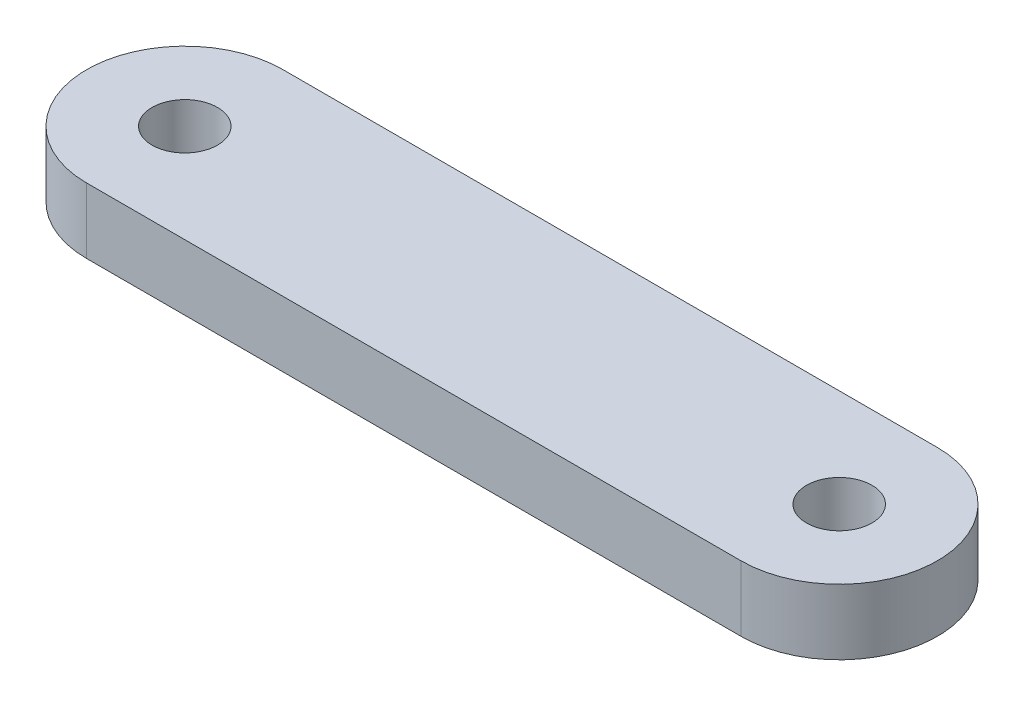
ISO-10303-21;
HEADER;
FILE_DESCRIPTION(('STEP AP214'),'2;1');
FILE_NAME('part.step','',(''),(''),'','','');
FILE_SCHEMA(('AUTOMOTIVE_DESIGN { 1 0 10303 214 1 1 1 1 }'));
ENDSEC;
DATA;
#1=APPLICATION_CONTEXT('core data for automotive mechanical design processes');
#2=APPLICATION_PROTOCOL_DEFINITION('international standard','automotive_design',2000,#1);
#3=PRODUCT_CONTEXT('',#1,'mechanical');
#4=PRODUCT('Part','Part','',(#3));
#5=PRODUCT_RELATED_PRODUCT_CATEGORY('part','',(#4));
#6=PRODUCT_DEFINITION_FORMATION('','',#4);
#7=PRODUCT_DEFINITION_CONTEXT('part definition',#1,'design');
#8=PRODUCT_DEFINITION('design','',#6,#7);
#9=PRODUCT_DEFINITION_SHAPE('','',#8);
#10=(LENGTH_UNIT() NAMED_UNIT(*) SI_UNIT(.MILLI.,.METRE.));
#11=(NAMED_UNIT(*) PLANE_ANGLE_UNIT() SI_UNIT($,.RADIAN.));
#12=(NAMED_UNIT(*) SI_UNIT($,.STERADIAN.) SOLID_ANGLE_UNIT());
#13=UNCERTAINTY_MEASURE_WITH_UNIT(LENGTH_MEASURE(1.E-05),#10,'distance_accuracy_value','');
#14=(GEOMETRIC_REPRESENTATION_CONTEXT(3) GLOBAL_UNCERTAINTY_ASSIGNED_CONTEXT((#13)) GLOBAL_UNIT_ASSIGNED_CONTEXT((#10,
#11,#12)) REPRESENTATION_CONTEXT('',''));
#15=CARTESIAN_POINT('',(0.,0.,0.));
#16=DIRECTION('',(0.,0.,1.));
#17=DIRECTION('',(1.,0.,0.));
#18=AXIS2_PLACEMENT_3D('',#15,#16,#17);
#19=CARTESIAN_POINT('',(50.,10.,0.));
#20=DIRECTION('',(0.,-1.,0.));
#21=DIRECTION('',(0.,0.,-1.));
#22=AXIS2_PLACEMENT_3D('',#19,#20,#21);
#23=CYLINDRICAL_SURFACE('',#22,15.);
#24=CARTESIAN_POINT('',(50.,0.,0.));
#25=DIRECTION('',(0.,1.,0.));
#26=DIRECTION('',(0.,0.,-1.));
#27=AXIS2_PLACEMENT_3D('',#24,#25,#26);
#28=CIRCLE('',#27,15.);
#29=CARTESIAN_POINT('',(50.,0.,15.));
#30=VERTEX_POINT('',#29);
#31=CARTESIAN_POINT('',(50.,0.,-15.));
#32=VERTEX_POINT('',#31);
#33=EDGE_CURVE('E111',#30,#32,#28,.T.);
#34=ORIENTED_EDGE('',*,*,#33,.T.);
#35=DIRECTION('',(0.,-1.,0.));
#36=VECTOR('',#35,1.);
#37=CARTESIAN_POINT('',(50.,10.,-15.));
#38=LINE('',#37,#36);
#39=CARTESIAN_POINT('',(50.,10.,-15.));
#40=VERTEX_POINT('',#39);
#41=EDGE_CURVE('E11',#40,#32,#38,.T.);
#42=ORIENTED_EDGE('',*,*,#41,.F.);
#43=CARTESIAN_POINT('',(50.,10.,0.));
#44=DIRECTION('',(0.,1.,0.));
#45=DIRECTION('',(0.,0.,-1.));
#46=AXIS2_PLACEMENT_3D('',#43,#44,#45);
#47=CIRCLE('',#46,15.);
#48=CARTESIAN_POINT('',(50.,10.,15.));
#49=VERTEX_POINT('',#48);
#50=EDGE_CURVE('E95',#49,#40,#47,.T.);
#51=ORIENTED_EDGE('',*,*,#50,.F.);
#52=DIRECTION('',(0.,-1.,0.));
#53=VECTOR('',#52,1.);
#54=CARTESIAN_POINT('',(50.,10.,15.));
#55=LINE('',#54,#53);
#56=EDGE_CURVE('E107',#49,#30,#55,.T.);
#57=ORIENTED_EDGE('',*,*,#56,.T.);
#58=EDGE_LOOP('',(#34,#42,#51,#57));
#59=FACE_BOUND('',#58,.T.);
#60=ADVANCED_FACE('F43',(#59),#23,.T.);
#61=CARTESIAN_POINT('',(-50.,10.,-15.));
#62=DIRECTION('',(0.,0.,1.));
#63=DIRECTION('',(1.,0.,0.));
#64=AXIS2_PLACEMENT_3D('',#61,#62,#63);
#65=PLANE('',#64);
#66=DIRECTION('',(-1.,0.,0.));
#67=VECTOR('',#66,1.);
#68=CARTESIAN_POINT('',(-50.,0.,-15.));
#69=LINE('',#68,#67);
#70=CARTESIAN_POINT('',(-50.,0.,-15.));
#71=VERTEX_POINT('',#70);
#72=EDGE_CURVE('E100',#32,#71,#69,.T.);
#73=ORIENTED_EDGE('',*,*,#72,.T.);
#74=DIRECTION('',(0.,-1.,0.));
#75=VECTOR('',#74,1.);
#76=CARTESIAN_POINT('',(-50.,10.,-15.));
#77=LINE('',#76,#75);
#78=CARTESIAN_POINT('',(-50.,10.,-15.));
#79=VERTEX_POINT('',#78);
#80=EDGE_CURVE('E52',#79,#71,#77,.T.);
#81=ORIENTED_EDGE('',*,*,#80,.F.);
#82=DIRECTION('',(-1.,0.,0.));
#83=VECTOR('',#82,1.);
#84=CARTESIAN_POINT('',(-50.,10.,-15.));
#85=LINE('',#84,#83);
#86=EDGE_CURVE('E90',#40,#79,#85,.T.);
#87=ORIENTED_EDGE('',*,*,#86,.F.);
#88=ORIENTED_EDGE('',*,*,#41,.T.);
#89=EDGE_LOOP('',(#73,#81,#87,#88));
#90=FACE_BOUND('',#89,.T.);
#91=ADVANCED_FACE('F99',(#90),#65,.F.);
#92=CARTESIAN_POINT('',(-50.,10.,0.));
#93=DIRECTION('',(0.,-1.,0.));
#94=DIRECTION('',(0.,0.,-1.));
#95=AXIS2_PLACEMENT_3D('',#92,#93,#94);
#96=CYLINDRICAL_SURFACE('',#95,15.);
#97=CARTESIAN_POINT('',(-50.,0.,0.));
#98=DIRECTION('',(0.,1.,0.));
#99=DIRECTION('',(0.,0.,1.));
#100=AXIS2_PLACEMENT_3D('',#97,#98,#99);
#101=CIRCLE('',#100,15.);
#102=CARTESIAN_POINT('',(-50.,0.,15.));
#103=VERTEX_POINT('',#102);
#104=EDGE_CURVE('E77',#71,#103,#101,.T.);
#105=ORIENTED_EDGE('',*,*,#104,.T.);
#106=DIRECTION('',(0.,-1.,0.));
#107=VECTOR('',#106,1.);
#108=CARTESIAN_POINT('',(-50.,10.,15.));
#109=LINE('',#108,#107);
#110=CARTESIAN_POINT('',(-50.,10.,15.));
#111=VERTEX_POINT('',#110);
#112=EDGE_CURVE('E102',#111,#103,#109,.T.);
#113=ORIENTED_EDGE('',*,*,#112,.F.);
#114=CARTESIAN_POINT('',(-50.,10.,0.));
#115=DIRECTION('',(0.,1.,0.));
#116=DIRECTION('',(0.,0.,1.));
#117=AXIS2_PLACEMENT_3D('',#114,#115,#116);
#118=CIRCLE('',#117,15.);
#119=EDGE_CURVE('E93',#79,#111,#118,.T.);
#120=ORIENTED_EDGE('',*,*,#119,.F.);
#121=ORIENTED_EDGE('',*,*,#80,.T.);
#122=EDGE_LOOP('',(#105,#113,#120,#121));
#123=FACE_BOUND('',#122,.T.);
#124=ADVANCED_FACE('F103',(#123),#96,.T.);
#125=CARTESIAN_POINT('',(-50.,10.,15.));
#126=DIRECTION('',(0.,0.,-1.));
#127=DIRECTION('',(-1.,0.,0.));
#128=AXIS2_PLACEMENT_3D('',#125,#126,#127);
#129=PLANE('',#128);
#130=DIRECTION('',(1.,0.,0.));
#131=VECTOR('',#130,1.);
#132=CARTESIAN_POINT('',(-50.,0.,15.));
#133=LINE('',#132,#131);
#134=EDGE_CURVE('E83',#103,#30,#133,.T.);
#135=ORIENTED_EDGE('',*,*,#134,.T.);
#136=ORIENTED_EDGE('',*,*,#56,.F.);
#137=DIRECTION('',(1.,0.,0.));
#138=VECTOR('',#137,1.);
#139=CARTESIAN_POINT('',(-50.,10.,15.));
#140=LINE('',#139,#138);
#141=EDGE_CURVE('E60',#111,#49,#140,.T.);
#142=ORIENTED_EDGE('',*,*,#141,.F.);
#143=ORIENTED_EDGE('',*,*,#112,.T.);
#144=EDGE_LOOP('',(#135,#136,#142,#143));
#145=FACE_BOUND('',#144,.T.);
#146=ADVANCED_FACE('F125',(#145),#129,.F.);
#147=CARTESIAN_POINT('',(50.,10.,0.));
#148=DIRECTION('',(0.,-1.,0.));
#149=DIRECTION('',(0.,0.,-1.));
#150=AXIS2_PLACEMENT_3D('',#147,#148,#149);
#151=PLANE('',#150);
#152=CARTESIAN_POINT('',(-50.,10.,0.));
#153=DIRECTION('',(0.,1.,0.));
#154=DIRECTION('',(0.,0.,1.));
#155=AXIS2_PLACEMENT_3D('',#152,#153,#154);
#156=CIRCLE('',#155,5.);
#157=CARTESIAN_POINT('',(-50.,10.,5.));
#158=VERTEX_POINT('',#157);
#159=EDGE_CURVE('E140',#158,#158,#156,.T.);
#160=ORIENTED_EDGE('',*,*,#159,.F.);
#161=EDGE_LOOP('',(#160));
#162=FACE_BOUND('',#161,.T.);
#163=CARTESIAN_POINT('',(50.,10.,0.));
#164=DIRECTION('',(0.,1.,0.));
#165=DIRECTION('',(0.,0.,-1.));
#166=AXIS2_PLACEMENT_3D('',#163,#164,#165);
#167=CIRCLE('',#166,5.);
#168=CARTESIAN_POINT('',(50.,10.,-5.));
#169=VERTEX_POINT('',#168);
#170=EDGE_CURVE('E136',#169,#169,#167,.T.);
#171=ORIENTED_EDGE('',*,*,#170,.F.);
#172=EDGE_LOOP('',(#171));
#173=FACE_BOUND('',#172,.T.);
#174=ORIENTED_EDGE('',*,*,#50,.T.);
#175=ORIENTED_EDGE('',*,*,#86,.T.);
#176=ORIENTED_EDGE('',*,*,#119,.T.);
#177=ORIENTED_EDGE('',*,*,#141,.T.);
#178=EDGE_LOOP('',(#174,#175,#176,#177));
#179=FACE_BOUND('',#178,.T.);
#180=ADVANCED_FACE('F91',(#162,#173,#179),#151,.F.);
#181=CARTESIAN_POINT('',(50.,0.,0.));
#182=DIRECTION('',(0.,-1.,0.));
#183=DIRECTION('',(0.,0.,-1.));
#184=AXIS2_PLACEMENT_3D('',#181,#182,#183);
#185=PLANE('',#184);
#186=CARTESIAN_POINT('',(-50.,0.,0.));
#187=DIRECTION('',(0.,1.,0.));
#188=DIRECTION('',(0.,0.,1.));
#189=AXIS2_PLACEMENT_3D('',#186,#187,#188);
#190=CIRCLE('',#189,5.);
#191=CARTESIAN_POINT('',(-50.,0.,5.));
#192=VERTEX_POINT('',#191);
#193=EDGE_CURVE('E115',#192,#192,#190,.T.);
#194=ORIENTED_EDGE('',*,*,#193,.T.);
#195=EDGE_LOOP('',(#194));
#196=FACE_BOUND('',#195,.T.);
#197=CARTESIAN_POINT('',(50.,0.,0.));
#198=DIRECTION('',(0.,1.,0.));
#199=DIRECTION('',(0.,0.,-1.));
#200=AXIS2_PLACEMENT_3D('',#197,#198,#199);
#201=CIRCLE('',#200,5.);
#202=CARTESIAN_POINT('',(50.,0.,-5.));
#203=VERTEX_POINT('',#202);
#204=EDGE_CURVE('E132',#203,#203,#201,.T.);
#205=ORIENTED_EDGE('',*,*,#204,.T.);
#206=EDGE_LOOP('',(#205));
#207=FACE_BOUND('',#206,.T.);
#208=ORIENTED_EDGE('',*,*,#33,.F.);
#209=ORIENTED_EDGE('',*,*,#134,.F.);
#210=ORIENTED_EDGE('',*,*,#104,.F.);
#211=ORIENTED_EDGE('',*,*,#72,.F.);
#212=EDGE_LOOP('',(#208,#209,#210,#211));
#213=FACE_BOUND('',#212,.T.);
#214=ADVANCED_FACE('F128',(#196,#207,#213),#185,.T.);
#215=CARTESIAN_POINT('',(50.,0.,0.));
#216=DIRECTION('',(0.,1.,0.));
#217=DIRECTION('',(0.,0.,1.));
#218=AXIS2_PLACEMENT_3D('',#215,#216,#217);
#219=CYLINDRICAL_SURFACE('',#218,5.);
#220=ORIENTED_EDGE('',*,*,#204,.F.);
#221=EDGE_LOOP('',(#220));
#222=FACE_BOUND('',#221,.T.);
#223=ORIENTED_EDGE('',*,*,#170,.T.);
#224=EDGE_LOOP('',(#223));
#225=FACE_BOUND('',#224,.T.);
#226=ADVANCED_FACE('F153',(#222,#225),#219,.F.);
#227=CARTESIAN_POINT('',(-50.,0.,0.));
#228=DIRECTION('',(0.,1.,0.));
#229=DIRECTION('',(0.,0.,1.));
#230=AXIS2_PLACEMENT_3D('',#227,#228,#229);
#231=CYLINDRICAL_SURFACE('',#230,5.);
#232=ORIENTED_EDGE('',*,*,#193,.F.);
#233=EDGE_LOOP('',(#232));
#234=FACE_BOUND('',#233,.T.);
#235=ORIENTED_EDGE('',*,*,#159,.T.);
#236=EDGE_LOOP('',(#235));
#237=FACE_BOUND('',#236,.T.);
#238=ADVANCED_FACE('F150',(#234,#237),#231,.F.);
#239=CLOSED_SHELL('',(#60,#91,#124,#146,#180,#214,#226,#238));
#240=MANIFOLD_SOLID_BREP('B2',#239);
#241=ADVANCED_BREP_SHAPE_REPRESENTATION('',(#18,#240),#14);
#242=SHAPE_DEFINITION_REPRESENTATION(#9,#241);
ENDSEC;
END-ISO-10303-21;
